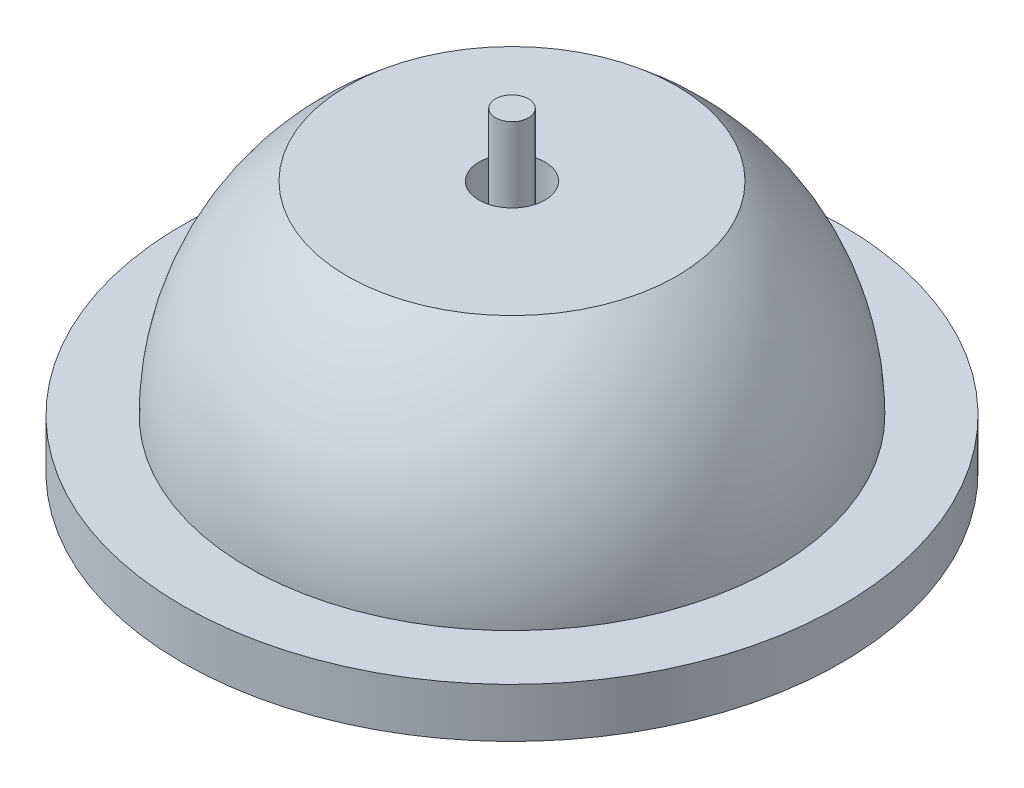
ISO-10303-21;
HEADER;
FILE_DESCRIPTION(('STEP AP214'),'2;1');
FILE_NAME('part.step','',(''),(''),'','','');
FILE_SCHEMA(('AUTOMOTIVE_DESIGN { 1 0 10303 214 1 1 1 1 }'));
ENDSEC;
DATA;
#1=APPLICATION_CONTEXT('core data for automotive mechanical design processes');
#2=APPLICATION_PROTOCOL_DEFINITION('international standard','automotive_design',2000,#1);
#3=PRODUCT_CONTEXT('',#1,'mechanical');
#4=PRODUCT('Part','Part','',(#3));
#5=PRODUCT_RELATED_PRODUCT_CATEGORY('part','',(#4));
#6=PRODUCT_DEFINITION_FORMATION('','',#4);
#7=PRODUCT_DEFINITION_CONTEXT('part definition',#1,'design');
#8=PRODUCT_DEFINITION('design','',#6,#7);
#9=PRODUCT_DEFINITION_SHAPE('','',#8);
#10=(LENGTH_UNIT() NAMED_UNIT(*) SI_UNIT(.MILLI.,.METRE.));
#11=(NAMED_UNIT(*) PLANE_ANGLE_UNIT() SI_UNIT($,.RADIAN.));
#12=(NAMED_UNIT(*) SI_UNIT($,.STERADIAN.) SOLID_ANGLE_UNIT());
#13=UNCERTAINTY_MEASURE_WITH_UNIT(LENGTH_MEASURE(1.E-05),#10,'distance_accuracy_value','');
#14=(GEOMETRIC_REPRESENTATION_CONTEXT(3) GLOBAL_UNCERTAINTY_ASSIGNED_CONTEXT((#13)) GLOBAL_UNIT_ASSIGNED_CONTEXT((#10,
#11,#12)) REPRESENTATION_CONTEXT('',''));
#15=CARTESIAN_POINT('',(0.,0.,0.));
#16=DIRECTION('',(0.,0.,1.));
#17=DIRECTION('',(1.,0.,0.));
#18=AXIS2_PLACEMENT_3D('',#15,#16,#17);
#19=CARTESIAN_POINT('',(0.,95.6846916910374,0.));
#20=DIRECTION('',(0.,-1.,0.));
#21=DIRECTION('',(0.,0.,-1.));
#22=AXIS2_PLACEMENT_3D('',#19,#20,#21);
#23=PLANE('',#22);
#24=CARTESIAN_POINT('',(0.,95.6846916910373,0.));
#25=DIRECTION('',(0.,-1.,0.));
#26=DIRECTION('',(0.,0.,-1.));
#27=AXIS2_PLACEMENT_3D('',#24,#25,#26);
#28=CIRCLE('',#27,4.99740445736434);
#29=CARTESIAN_POINT('',(0.,95.6846916910373,-4.99740445736434));
#30=VERTEX_POINT('',#29);
#31=EDGE_CURVE('E12',#30,#30,#28,.T.);
#32=ORIENTED_EDGE('',*,*,#31,.F.);
#33=EDGE_LOOP('',(#32));
#34=FACE_BOUND('',#33,.T.);
#35=ADVANCED_FACE('F51',(#34),#23,.F.);
#36=CARTESIAN_POINT('',(0.,-4.17910675857507,0.));
#37=DIRECTION('',(0.,-1.,0.));
#38=DIRECTION('',(0.,0.,-1.));
#39=AXIS2_PLACEMENT_3D('',#36,#37,#38);
#40=CYLINDRICAL_SURFACE('',#39,4.99740445736433);
#41=CARTESIAN_POINT('',(0.,-4.17910675857507,0.));
#42=DIRECTION('',(0.,-1.,0.));
#43=DIRECTION('',(0.,0.,-1.));
#44=AXIS2_PLACEMENT_3D('',#41,#42,#43);
#45=CIRCLE('',#44,4.99740445736433);
#46=CARTESIAN_POINT('',(0.,-4.17910675857507,-4.99740445736433));
#47=VERTEX_POINT('',#46);
#48=EDGE_CURVE('E57',#47,#47,#45,.T.);
#49=ORIENTED_EDGE('',*,*,#48,.F.);
#50=EDGE_LOOP('',(#49));
#51=FACE_BOUND('',#50,.T.);
#52=ORIENTED_EDGE('',*,*,#31,.T.);
#53=EDGE_LOOP('',(#52));
#54=FACE_BOUND('',#53,.T.);
#55=ADVANCED_FACE('F80',(#51,#54),#40,.T.);
#56=CARTESIAN_POINT('',(0.,-4.17910675857507,0.));
#57=DIRECTION('',(0.,-1.,0.));
#58=DIRECTION('',(0.,0.,-1.));
#59=AXIS2_PLACEMENT_3D('',#56,#57,#58);
#60=PLANE('',#59);
#61=ORIENTED_EDGE('',*,*,#48,.T.);
#62=EDGE_LOOP('',(#61));
#63=FACE_BOUND('',#62,.T.);
#64=CARTESIAN_POINT('',(0.,-4.17910675857507,0.));
#65=DIRECTION('',(0.,-1.,0.));
#66=DIRECTION('',(0.,0.,-1.));
#67=AXIS2_PLACEMENT_3D('',#64,#65,#66);
#68=CIRCLE('',#67,15.6433419221379);
#69=CARTESIAN_POINT('',(0.,-4.17910675857507,-15.6433419221379));
#70=VERTEX_POINT('',#69);
#71=EDGE_CURVE('E67',#70,#70,#68,.T.);
#72=ORIENTED_EDGE('',*,*,#71,.F.);
#73=EDGE_LOOP('',(#72));
#74=FACE_BOUND('',#73,.T.);
#75=ADVANCED_FACE('F63',(#63,#74),#60,.F.);
#76=CARTESIAN_POINT('',(-15.6433419221379,-4.17910675857507,0.));
#77=CARTESIAN_POINT('',(0.,-19.7298976021996,0.));
#78=CARTESIAN_POINT('',(-13.0661293018734,-24.8785186848244,0.));
#79=CARTESIAN_POINT('',(0.,-19.7298976021996,0.));
#80=B_SPLINE_CURVE_WITH_KNOTS('',3,(#76,#77,#78,#79),.UNSPECIFIED.,.F.,.F.,(4,4),(0.,1.),.UNSPECIFIED.);
#81=CARTESIAN_POINT('',(0.,-28.2036531352395,0.));
#82=DIRECTION('',(0.,-1.,0.));
#83=AXIS1_PLACEMENT('',#81,#82);
#84=SURFACE_OF_REVOLUTION('',#80,#83);
#85=CARTESIAN_POINT('',(0.,-19.7298976021996,0.));
#86=VERTEX_POINT('',#85);
#87=VERTEX_LOOP('',#86);
#88=FACE_BOUND('',#87,.T.);
#89=ORIENTED_EDGE('',*,*,#71,.T.);
#90=EDGE_LOOP('',(#89));
#91=FACE_BOUND('',#90,.T.);
#92=ADVANCED_FACE('F60',(#88,#91),#84,.T.);
#93=CLOSED_SHELL('',(#35,#55,#75,#92));
#94=MANIFOLD_SOLID_BREP('B2',#93);
#95=CARTESIAN_POINT('',(0.,0.,0.));
#96=DIRECTION('',(0.,1.,0.));
#97=DIRECTION('',(0.,0.,1.));
#98=AXIS2_PLACEMENT_3D('',#95,#96,#97);
#99=PLANE('',#98);
#100=CARTESIAN_POINT('',(0.,0.,0.));
#101=DIRECTION('',(0.,1.,0.));
#102=DIRECTION('',(0.,0.,1.));
#103=AXIS2_PLACEMENT_3D('',#100,#101,#102);
#104=CIRCLE('',#103,10.);
#105=CARTESIAN_POINT('',(0.,0.,10.));
#106=VERTEX_POINT('',#105);
#107=EDGE_CURVE('E136',#106,#106,#104,.F.);
#108=ORIENTED_EDGE('',*,*,#107,.F.);
#109=EDGE_LOOP('',(#108));
#110=FACE_BOUND('',#109,.T.);
#111=CARTESIAN_POINT('',(0.,0.,0.));
#112=DIRECTION('',(0.,-1.,0.));
#113=DIRECTION('',(0.,0.,-1.));
#114=AXIS2_PLACEMENT_3D('',#111,#112,#113);
#115=CIRCLE('',#114,100.);
#116=CARTESIAN_POINT('',(0.,0.,-100.));
#117=VERTEX_POINT('',#116);
#118=EDGE_CURVE('E50',#117,#117,#115,.T.);
#119=ORIENTED_EDGE('',*,*,#118,.T.);
#120=EDGE_LOOP('',(#119));
#121=FACE_BOUND('',#120,.T.);
#122=ADVANCED_FACE('F117',(#110,#121),#99,.F.);
#123=CARTESIAN_POINT('',(0.,-54.4300625811784,0.));
#124=DIRECTION('',(0.,-1.,0.));
#125=DIRECTION('',(0.,0.,-1.));
#126=AXIS2_PLACEMENT_3D('',#123,#124,#125);
#127=CYLINDRICAL_SURFACE('',#126,100.);
#128=ORIENTED_EDGE('',*,*,#118,.F.);
#129=EDGE_LOOP('',(#128));
#130=FACE_BOUND('',#129,.T.);
#131=CARTESIAN_POINT('',(0.,15.,0.));
#132=DIRECTION('',(0.,-1.,0.));
#133=DIRECTION('',(0.,0.,-1.));
#134=AXIS2_PLACEMENT_3D('',#131,#132,#133);
#135=CIRCLE('',#134,100.);
#136=CARTESIAN_POINT('',(0.,15.,-100.));
#137=VERTEX_POINT('',#136);
#138=EDGE_CURVE('E124',#137,#137,#135,.T.);
#139=ORIENTED_EDGE('',*,*,#138,.T.);
#140=EDGE_LOOP('',(#139));
#141=FACE_BOUND('',#140,.T.);
#142=ADVANCED_FACE('F175',(#130,#141),#127,.T.);
#143=CARTESIAN_POINT('',(-100.,15.,0.));
#144=DIRECTION('',(0.,-1.,0.));
#145=DIRECTION('',(0.,0.,-1.));
#146=AXIS2_PLACEMENT_3D('',#143,#144,#145);
#147=PLANE('',#146);
#148=ORIENTED_EDGE('',*,*,#138,.F.);
#149=EDGE_LOOP('',(#148));
#150=FACE_BOUND('',#149,.T.);
#151=CARTESIAN_POINT('',(0.,15.,0.));
#152=DIRECTION('',(0.,-1.,0.));
#153=DIRECTION('',(0.,0.,-1.));
#154=AXIS2_PLACEMENT_3D('',#151,#152,#153);
#155=CIRCLE('',#154,80.);
#156=CARTESIAN_POINT('',(0.,15.,-80.));
#157=VERTEX_POINT('',#156);
#158=EDGE_CURVE('E128',#157,#157,#155,.T.);
#159=ORIENTED_EDGE('',*,*,#158,.T.);
#160=EDGE_LOOP('',(#159));
#161=FACE_BOUND('',#160,.T.);
#162=ADVANCED_FACE('F172',(#150,#161),#147,.F.);
#163=CARTESIAN_POINT('',(0.,15.,0.));
#164=DIRECTION('',(0.,-1.,0.));
#165=DIRECTION('',(0.,0.,-1.));
#166=AXIS2_PLACEMENT_3D('',#163,#164,#165);
#167=DEGENERATE_TOROIDAL_SURFACE('',#166,1.83214766625112,78.1678523337489,.T.);
#168=ORIENTED_EDGE('',*,*,#158,.F.);
#169=EDGE_LOOP('',(#168));
#170=FACE_BOUND('',#169,.T.);
#171=CARTESIAN_POINT('',(0.,76.5635536663124,0.));
#172=DIRECTION('',(0.,-1.,0.));
#173=DIRECTION('',(0.,0.,-1.));
#174=AXIS2_PLACEMENT_3D('',#171,#172,#173);
#175=CIRCLE('',#174,50.);
#176=CARTESIAN_POINT('',(0.,76.5635536663124,-50.));
#177=VERTEX_POINT('',#176);
#178=EDGE_CURVE('E133',#177,#177,#175,.T.);
#179=ORIENTED_EDGE('',*,*,#178,.T.);
#180=EDGE_LOOP('',(#179));
#181=FACE_BOUND('',#180,.T.);
#182=ADVANCED_FACE('F168',(#170,#181),#167,.T.);
#183=CARTESIAN_POINT('',(-50.,76.5635536663124,0.));
#184=DIRECTION('',(0.,-1.,0.));
#185=DIRECTION('',(0.,0.,-1.));
#186=AXIS2_PLACEMENT_3D('',#183,#184,#185);
#187=PLANE('',#186);
#188=CARTESIAN_POINT('',(0.,76.5635536663124,0.));
#189=DIRECTION('',(0.,-1.,0.));
#190=DIRECTION('',(0.,0.,-1.));
#191=AXIS2_PLACEMENT_3D('',#188,#189,#190);
#192=CIRCLE('',#191,10.);
#193=CARTESIAN_POINT('',(0.,76.5635536663124,-10.));
#194=VERTEX_POINT('',#193);
#195=EDGE_CURVE('E120',#194,#194,#192,.F.);
#196=ORIENTED_EDGE('',*,*,#195,.F.);
#197=EDGE_LOOP('',(#196));
#198=FACE_BOUND('',#197,.T.);
#199=ORIENTED_EDGE('',*,*,#178,.F.);
#200=EDGE_LOOP('',(#199));
#201=FACE_BOUND('',#200,.T.);
#202=ADVANCED_FACE('F164',(#198,#201),#187,.F.);
#203=CARTESIAN_POINT('',(0.,-4.61228001438901,0.));
#204=DIRECTION('',(0.,-1.,0.));
#205=DIRECTION('',(0.,0.,-1.));
#206=AXIS2_PLACEMENT_3D('',#203,#204,#205);
#207=CYLINDRICAL_SURFACE('',#206,10.);
#208=ORIENTED_EDGE('',*,*,#195,.T.);
#209=EDGE_LOOP('',(#208));
#210=FACE_BOUND('',#209,.T.);
#211=ORIENTED_EDGE('',*,*,#107,.T.);
#212=EDGE_LOOP('',(#211));
#213=FACE_BOUND('',#212,.T.);
#214=ADVANCED_FACE('F161',(#210,#213),#207,.F.);
#215=CLOSED_SHELL('',(#122,#142,#162,#182,#202,#214));
#216=CARTESIAN_POINT('',(0.,15.,0.));
#217=DIRECTION('',(0.,-1.,0.));
#218=DIRECTION('',(0.,0.,-1.));
#219=AXIS2_PLACEMENT_3D('',#216,#217,#218);
#220=PLANE('',#219);
#221=CARTESIAN_POINT('',(0.,15.,0.));
#222=DIRECTION('',(0.,-1.,0.));
#223=DIRECTION('',(0.,0.,-1.));
#224=AXIS2_PLACEMENT_3D('',#221,#222,#223);
#225=CIRCLE('',#224,49.7885339951784);
#226=CARTESIAN_POINT('',(0.,15.,-49.7885339951784));
#227=VERTEX_POINT('',#226);
#228=EDGE_CURVE('E139',#227,#227,#225,.T.);
#229=ORIENTED_EDGE('',*,*,#228,.F.);
#230=EDGE_LOOP('',(#229));
#231=FACE_BOUND('',#230,.T.);
#232=CARTESIAN_POINT('',(0.,15.,0.));
#233=DIRECTION('',(0.,-1.,0.));
#234=DIRECTION('',(0.,0.,-1.));
#235=AXIS2_PLACEMENT_3D('',#232,#233,#234);
#236=CIRCLE('',#235,16.4036620653152);
#237=CARTESIAN_POINT('',(0.,15.,-16.4036620653152));
#238=VERTEX_POINT('',#237);
#239=EDGE_CURVE('E142',#238,#238,#236,.T.);
#240=ORIENTED_EDGE('',*,*,#239,.T.);
#241=EDGE_LOOP('',(#240));
#242=FACE_BOUND('',#241,.T.);
#243=ADVANCED_FACE('F155',(#231,#242),#220,.F.);
#244=CARTESIAN_POINT('',(49.7885339951784,15.,0.));
#245=CARTESIAN_POINT('',(35.9877731193098,19.719088145664,0.));
#246=CARTESIAN_POINT('',(16.4036620653152,19.2262513355908,0.));
#247=CARTESIAN_POINT('',(16.4036620653152,15.,0.));
#248=B_SPLINE_CURVE_WITH_KNOTS('',3,(#244,#245,#246,#247),.UNSPECIFIED.,.F.,.F.,(4,4),(0.,1.),.UNSPECIFIED.);
#249=CARTESIAN_POINT('',(0.,-28.2036531352395,0.));
#250=DIRECTION('',(0.,-1.,0.));
#251=AXIS1_PLACEMENT('',#249,#250);
#252=SURFACE_OF_REVOLUTION('',#248,#251);
#253=ORIENTED_EDGE('',*,*,#239,.F.);
#254=EDGE_LOOP('',(#253));
#255=FACE_BOUND('',#254,.T.);
#256=ORIENTED_EDGE('',*,*,#228,.T.);
#257=EDGE_LOOP('',(#256));
#258=FACE_BOUND('',#257,.T.);
#259=ADVANCED_FACE('F152',(#255,#258),#252,.T.);
#260=CLOSED_SHELL('',(#243,#259));
#261=ORIENTED_CLOSED_SHELL('',*,#260,.T.);
#262=BREP_WITH_VOIDS('B6',#215,(#261));
#263=ADVANCED_BREP_SHAPE_REPRESENTATION('',(#18,#94,#262),#14);
#264=SHAPE_DEFINITION_REPRESENTATION(#9,#263);
ENDSEC;
END-ISO-10303-21;
